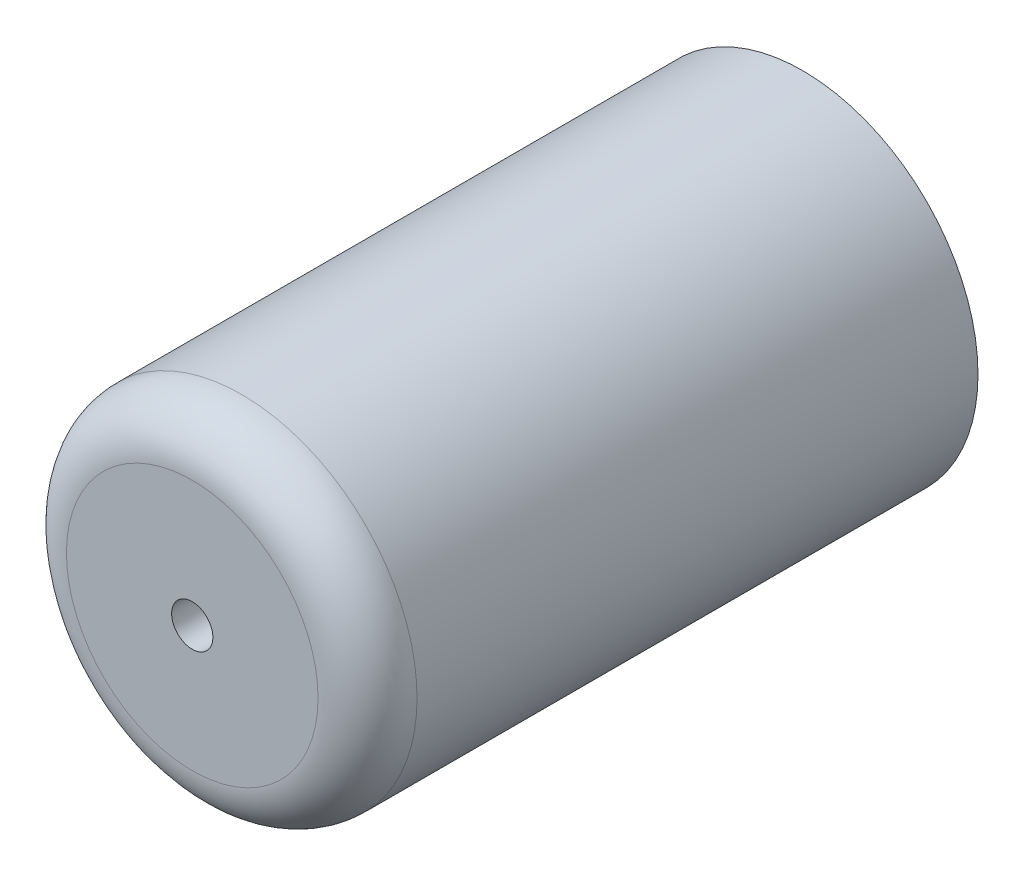
ISO-10303-21;
HEADER;
FILE_DESCRIPTION(('STEP AP214'),'2;1');
FILE_NAME('part.step','',(''),(''),'','','');
FILE_SCHEMA(('AUTOMOTIVE_DESIGN { 1 0 10303 214 1 1 1 1 }'));
ENDSEC;
DATA;
#1=APPLICATION_CONTEXT('core data for automotive mechanical design processes');
#2=APPLICATION_PROTOCOL_DEFINITION('international standard','automotive_design',2000,#1);
#3=PRODUCT_CONTEXT('',#1,'mechanical');
#4=PRODUCT('Part','Part','',(#3));
#5=PRODUCT_RELATED_PRODUCT_CATEGORY('part','',(#4));
#6=PRODUCT_DEFINITION_FORMATION('','',#4);
#7=PRODUCT_DEFINITION_CONTEXT('part definition',#1,'design');
#8=PRODUCT_DEFINITION('design','',#6,#7);
#9=PRODUCT_DEFINITION_SHAPE('','',#8);
#10=(LENGTH_UNIT() NAMED_UNIT(*) SI_UNIT(.MILLI.,.METRE.));
#11=(NAMED_UNIT(*) PLANE_ANGLE_UNIT() SI_UNIT($,.RADIAN.));
#12=(NAMED_UNIT(*) SI_UNIT($,.STERADIAN.) SOLID_ANGLE_UNIT());
#13=UNCERTAINTY_MEASURE_WITH_UNIT(LENGTH_MEASURE(1.E-05),#10,'distance_accuracy_value','');
#14=(GEOMETRIC_REPRESENTATION_CONTEXT(3) GLOBAL_UNCERTAINTY_ASSIGNED_CONTEXT((#13)) GLOBAL_UNIT_ASSIGNED_CONTEXT((#10,
#11,#12)) REPRESENTATION_CONTEXT('',''));
#15=CARTESIAN_POINT('',(0.,0.,0.));
#16=DIRECTION('',(0.,0.,1.));
#17=DIRECTION('',(1.,0.,0.));
#18=AXIS2_PLACEMENT_3D('',#15,#16,#17);
#19=CARTESIAN_POINT('',(0.,0.,0.));
#20=DIRECTION('',(0.,0.,1.));
#21=DIRECTION('',(1.,0.,0.));
#22=AXIS2_PLACEMENT_3D('',#19,#20,#21);
#23=PLANE('',#22);
#24=CARTESIAN_POINT('',(0.,0.,0.));
#25=DIRECTION('',(0.,0.,1.));
#26=DIRECTION('',(1.,0.,0.));
#27=AXIS2_PLACEMENT_3D('',#24,#25,#26);
#28=CIRCLE('',#27,2.5);
#29=CARTESIAN_POINT('',(2.5,0.,0.));
#30=VERTEX_POINT('',#29);
#31=EDGE_CURVE('E49',#30,#30,#28,.T.);
#32=ORIENTED_EDGE('',*,*,#31,.T.);
#33=EDGE_LOOP('',(#32));
#34=FACE_BOUND('',#33,.T.);
#35=CARTESIAN_POINT('',(0.,0.,0.));
#36=DIRECTION('',(0.,0.,-1.));
#37=DIRECTION('',(-1.,0.,0.));
#38=AXIS2_PLACEMENT_3D('',#35,#36,#37);
#39=CIRCLE('',#38,4.445);
#40=CARTESIAN_POINT('',(-4.445,0.,0.));
#41=VERTEX_POINT('',#40);
#42=EDGE_CURVE('E61',#41,#41,#39,.T.);
#43=ORIENTED_EDGE('',*,*,#42,.T.);
#44=EDGE_LOOP('',(#43));
#45=FACE_BOUND('',#44,.T.);
#46=ADVANCED_FACE('F31',(#34,#45),#23,.F.);
#47=CARTESIAN_POINT('',(0.,0.,74.));
#48=DIRECTION('',(0.,0.,1.));
#49=DIRECTION('',(1.,0.,0.));
#50=AXIS2_PLACEMENT_3D('',#47,#48,#49);
#51=PLANE('',#50);
#52=CARTESIAN_POINT('',(0.,0.,74.));
#53=DIRECTION('',(0.,0.,1.));
#54=DIRECTION('',(1.,0.,0.));
#55=AXIS2_PLACEMENT_3D('',#52,#53,#54);
#56=CIRCLE('',#55,15.25);
#57=CARTESIAN_POINT('',(15.25,0.,74.));
#58=VERTEX_POINT('',#57);
#59=EDGE_CURVE('E38',#58,#58,#56,.T.);
#60=ORIENTED_EDGE('',*,*,#59,.T.);
#61=EDGE_LOOP('',(#60));
#62=FACE_BOUND('',#61,.T.);
#63=CARTESIAN_POINT('',(0.,0.,74.));
#64=DIRECTION('',(0.,0.,1.));
#65=DIRECTION('',(1.,0.,0.));
#66=AXIS2_PLACEMENT_3D('',#63,#64,#65);
#67=CIRCLE('',#66,2.5);
#68=CARTESIAN_POINT('',(2.5,0.,74.));
#69=VERTEX_POINT('',#68);
#70=EDGE_CURVE('E46',#69,#69,#67,.T.);
#71=ORIENTED_EDGE('',*,*,#70,.F.);
#72=EDGE_LOOP('',(#71));
#73=FACE_BOUND('',#72,.T.);
#74=ADVANCED_FACE('F86',(#62,#73),#51,.T.);
#75=CARTESIAN_POINT('',(0.,0.,0.));
#76=DIRECTION('',(0.,0.,-1.));
#77=DIRECTION('',(-1.,0.,0.));
#78=AXIS2_PLACEMENT_3D('',#75,#76,#77);
#79=CIRCLE('',#78,17.145);
#80=CARTESIAN_POINT('',(-17.145,0.,0.));
#81=VERTEX_POINT('',#80);
#82=EDGE_CURVE('E55',#81,#81,#79,.T.);
#83=ORIENTED_EDGE('',*,*,#82,.F.);
#84=EDGE_LOOP('',(#83));
#85=FACE_BOUND('',#84,.T.);
#86=CARTESIAN_POINT('',(0.,0.,0.));
#87=DIRECTION('',(0.,0.,1.));
#88=DIRECTION('',(1.,0.,0.));
#89=AXIS2_PLACEMENT_3D('',#86,#87,#88);
#90=CIRCLE('',#89,21.25);
#91=CARTESIAN_POINT('',(21.25,0.,0.));
#92=VERTEX_POINT('',#91);
#93=EDGE_CURVE('E42',#92,#92,#90,.T.);
#94=ORIENTED_EDGE('',*,*,#93,.F.);
#95=EDGE_LOOP('',(#94));
#96=FACE_BOUND('',#95,.T.);
#97=ADVANCED_FACE('F82',(#85,#96),#23,.F.);
#98=CARTESIAN_POINT('',(0.,0.,74.));
#99=DIRECTION('',(0.,0.,-1.));
#100=DIRECTION('',(-1.,0.,0.));
#101=AXIS2_PLACEMENT_3D('',#98,#99,#100);
#102=CYLINDRICAL_SURFACE('',#101,21.25);
#103=CARTESIAN_POINT('',(0.,0.,68.));
#104=DIRECTION('',(0.,0.,1.));
#105=DIRECTION('',(1.,0.,0.));
#106=AXIS2_PLACEMENT_3D('',#103,#104,#105);
#107=CIRCLE('',#106,21.25);
#108=CARTESIAN_POINT('',(21.25,0.,68.));
#109=VERTEX_POINT('',#108);
#110=EDGE_CURVE('E10',#109,#109,#107,.F.);
#111=ORIENTED_EDGE('',*,*,#110,.T.);
#112=EDGE_LOOP('',(#111));
#113=FACE_BOUND('',#112,.T.);
#114=ORIENTED_EDGE('',*,*,#93,.T.);
#115=EDGE_LOOP('',(#114));
#116=FACE_BOUND('',#115,.T.);
#117=ADVANCED_FACE('F85',(#113,#116),#102,.T.);
#118=CARTESIAN_POINT('',(0.,0.,74.));
#119=DIRECTION('',(0.,0.,-1.));
#120=DIRECTION('',(-1.,0.,0.));
#121=AXIS2_PLACEMENT_3D('',#118,#119,#120);
#122=CYLINDRICAL_SURFACE('',#121,2.5);
#123=ORIENTED_EDGE('',*,*,#70,.T.);
#124=EDGE_LOOP('',(#123));
#125=FACE_BOUND('',#124,.T.);
#126=ORIENTED_EDGE('',*,*,#31,.F.);
#127=EDGE_LOOP('',(#126));
#128=FACE_BOUND('',#127,.T.);
#129=ADVANCED_FACE('F91',(#125,#128),#122,.F.);
#130=CARTESIAN_POINT('',(0.,0.,68.));
#131=DIRECTION('',(0.,0.,1.));
#132=DIRECTION('',(1.,0.,0.));
#133=AXIS2_PLACEMENT_3D('',#130,#131,#132);
#134=TOROIDAL_SURFACE('',#133,15.25,6.);
#135=ORIENTED_EDGE('',*,*,#110,.F.);
#136=EDGE_LOOP('',(#135));
#137=FACE_BOUND('',#136,.T.);
#138=ORIENTED_EDGE('',*,*,#59,.F.);
#139=EDGE_LOOP('',(#138));
#140=FACE_BOUND('',#139,.T.);
#141=ADVANCED_FACE('F33',(#137,#140),#134,.T.);
#142=CARTESIAN_POINT('',(0.,0.,65.));
#143=DIRECTION('',(0.,0.,-1.));
#144=DIRECTION('',(-1.,0.,0.));
#145=AXIS2_PLACEMENT_3D('',#142,#143,#144);
#146=CYLINDRICAL_SURFACE('',#145,17.145);
#147=CARTESIAN_POINT('',(0.,0.,65.));
#148=DIRECTION('',(0.,0.,-1.));
#149=DIRECTION('',(-1.,0.,0.));
#150=AXIS2_PLACEMENT_3D('',#147,#148,#149);
#151=CIRCLE('',#150,17.145);
#152=CARTESIAN_POINT('',(-17.145,0.,65.));
#153=VERTEX_POINT('',#152);
#154=EDGE_CURVE('E52',#153,#153,#151,.T.);
#155=ORIENTED_EDGE('',*,*,#154,.F.);
#156=EDGE_LOOP('',(#155));
#157=FACE_BOUND('',#156,.T.);
#158=ORIENTED_EDGE('',*,*,#82,.T.);
#159=EDGE_LOOP('',(#158));
#160=FACE_BOUND('',#159,.T.);
#161=ADVANCED_FACE('F73',(#157,#160),#146,.F.);
#162=CARTESIAN_POINT('',(0.,0.,65.));
#163=DIRECTION('',(0.,0.,-1.));
#164=DIRECTION('',(-1.,0.,0.));
#165=AXIS2_PLACEMENT_3D('',#162,#163,#164);
#166=PLANE('',#165);
#167=CARTESIAN_POINT('',(0.,0.,65.));
#168=DIRECTION('',(0.,0.,-1.));
#169=DIRECTION('',(-1.,0.,0.));
#170=AXIS2_PLACEMENT_3D('',#167,#168,#169);
#171=CIRCLE('',#170,4.445);
#172=CARTESIAN_POINT('',(-4.445,0.,65.));
#173=VERTEX_POINT('',#172);
#174=EDGE_CURVE('E58',#173,#173,#171,.T.);
#175=ORIENTED_EDGE('',*,*,#174,.F.);
#176=EDGE_LOOP('',(#175));
#177=FACE_BOUND('',#176,.T.);
#178=ORIENTED_EDGE('',*,*,#154,.T.);
#179=EDGE_LOOP('',(#178));
#180=FACE_BOUND('',#179,.T.);
#181=ADVANCED_FACE('F70',(#177,#180),#166,.T.);
#182=CARTESIAN_POINT('',(0.,0.,65.));
#183=DIRECTION('',(0.,0.,-1.));
#184=DIRECTION('',(-1.,0.,0.));
#185=AXIS2_PLACEMENT_3D('',#182,#183,#184);
#186=CYLINDRICAL_SURFACE('',#185,4.445);
#187=ORIENTED_EDGE('',*,*,#174,.T.);
#188=EDGE_LOOP('',(#187));
#189=FACE_BOUND('',#188,.T.);
#190=ORIENTED_EDGE('',*,*,#42,.F.);
#191=EDGE_LOOP('',(#190));
#192=FACE_BOUND('',#191,.T.);
#193=ADVANCED_FACE('F67',(#189,#192),#186,.T.);
#194=CLOSED_SHELL('',(#46,#74,#97,#117,#129,#141,#161,#181,#193));
#195=MANIFOLD_SOLID_BREP('B2',#194);
#196=ADVANCED_BREP_SHAPE_REPRESENTATION('',(#18,#195),#14);
#197=SHAPE_DEFINITION_REPRESENTATION(#9,#196);
ENDSEC;
END-ISO-10303-21;
